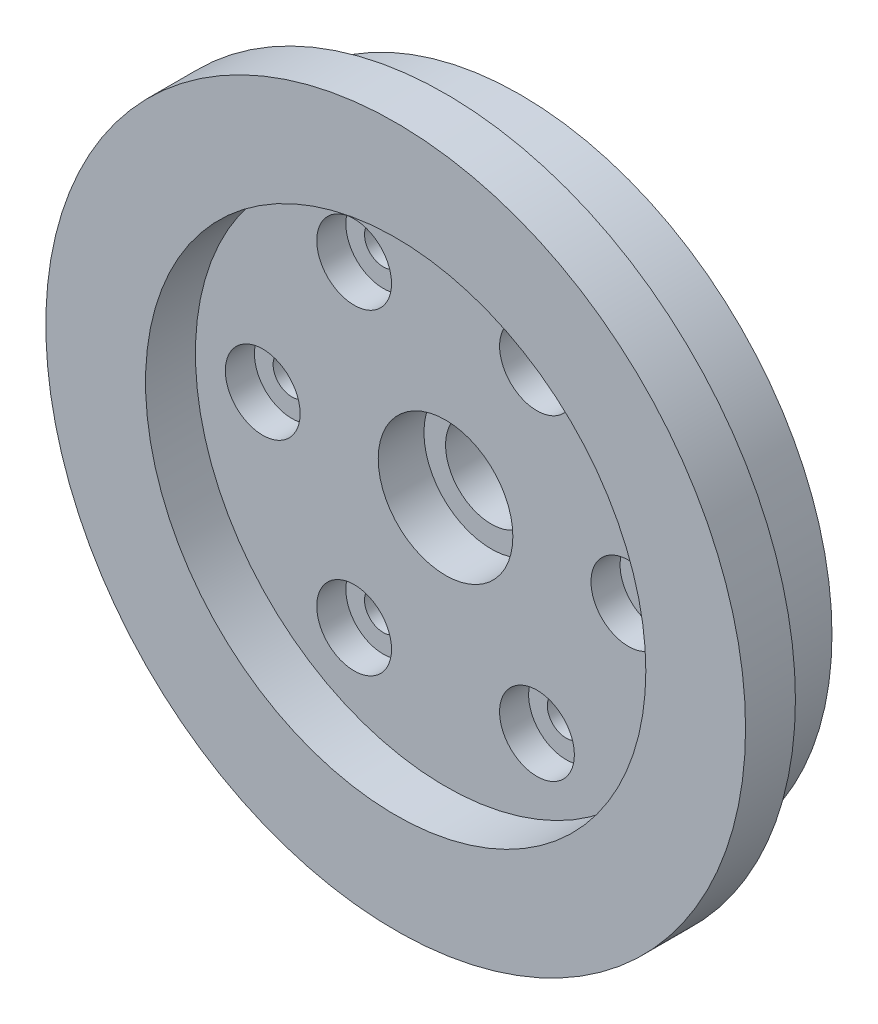
ISO-10303-21;
HEADER;
FILE_DESCRIPTION(('STEP AP214'),'2;1');
FILE_NAME('part.step','',(''),(''),'','','');
FILE_SCHEMA(('AUTOMOTIVE_DESIGN { 1 0 10303 214 1 1 1 1 }'));
ENDSEC;
DATA;
#1=APPLICATION_CONTEXT('core data for automotive mechanical design processes');
#2=APPLICATION_PROTOCOL_DEFINITION('international standard','automotive_design',2000,#1);
#3=PRODUCT_CONTEXT('',#1,'mechanical');
#4=PRODUCT('Part','Part','',(#3));
#5=PRODUCT_RELATED_PRODUCT_CATEGORY('part','',(#4));
#6=PRODUCT_DEFINITION_FORMATION('','',#4);
#7=PRODUCT_DEFINITION_CONTEXT('part definition',#1,'design');
#8=PRODUCT_DEFINITION('design','',#6,#7);
#9=PRODUCT_DEFINITION_SHAPE('','',#8);
#10=(LENGTH_UNIT() NAMED_UNIT(*) SI_UNIT(.MILLI.,.METRE.));
#11=(NAMED_UNIT(*) PLANE_ANGLE_UNIT() SI_UNIT($,.RADIAN.));
#12=(NAMED_UNIT(*) SI_UNIT($,.STERADIAN.) SOLID_ANGLE_UNIT());
#13=UNCERTAINTY_MEASURE_WITH_UNIT(LENGTH_MEASURE(1.E-05),#10,'distance_accuracy_value','');
#14=(GEOMETRIC_REPRESENTATION_CONTEXT(3) GLOBAL_UNCERTAINTY_ASSIGNED_CONTEXT((#13)) GLOBAL_UNIT_ASSIGNED_CONTEXT((#10,
#11,#12)) REPRESENTATION_CONTEXT('',''));
#15=CARTESIAN_POINT('',(0.,0.,0.));
#16=DIRECTION('',(0.,0.,1.));
#17=DIRECTION('',(1.,0.,0.));
#18=AXIS2_PLACEMENT_3D('',#15,#16,#17);
#19=CARTESIAN_POINT('',(0.,0.,10.));
#20=DIRECTION('',(0.,0.,1.));
#21=DIRECTION('',(1.,0.,0.));
#22=AXIS2_PLACEMENT_3D('',#19,#20,#21);
#23=PLANE('',#22);
#24=CARTESIAN_POINT('',(0.,0.,10.));
#25=DIRECTION('',(0.,0.,1.));
#26=DIRECTION('',(1.,0.,0.));
#27=AXIS2_PLACEMENT_3D('',#24,#25,#26);
#28=CIRCLE('',#27,8.1);
#29=CARTESIAN_POINT('',(8.1,0.,10.));
#30=VERTEX_POINT('',#29);
#31=EDGE_CURVE('E126',#30,#30,#28,.T.);
#32=ORIENTED_EDGE('',*,*,#31,.F.);
#33=EDGE_LOOP('',(#32));
#34=FACE_BOUND('',#33,.T.);
#35=CARTESIAN_POINT('',(-11.,19.0525588832576,10.));
#36=DIRECTION('',(0.,0.,1.));
#37=DIRECTION('',(1.,0.,0.));
#38=AXIS2_PLACEMENT_3D('',#35,#36,#37);
#39=CIRCLE('',#38,4.5);
#40=CARTESIAN_POINT('',(-6.50000000000001,19.0525588832576,10.));
#41=VERTEX_POINT('',#40);
#42=EDGE_CURVE('E240',#41,#41,#39,.T.);
#43=ORIENTED_EDGE('',*,*,#42,.F.);
#44=EDGE_LOOP('',(#43));
#45=FACE_BOUND('',#44,.T.);
#46=CARTESIAN_POINT('',(11.,19.0525588832576,10.));
#47=DIRECTION('',(0.,0.,1.));
#48=DIRECTION('',(1.,0.,0.));
#49=AXIS2_PLACEMENT_3D('',#46,#47,#48);
#50=CIRCLE('',#49,4.5);
#51=CARTESIAN_POINT('',(15.5,19.0525588832576,10.));
#52=VERTEX_POINT('',#51);
#53=EDGE_CURVE('E237',#52,#52,#50,.T.);
#54=ORIENTED_EDGE('',*,*,#53,.F.);
#55=EDGE_LOOP('',(#54));
#56=FACE_BOUND('',#55,.T.);
#57=CARTESIAN_POINT('',(22.,0.,10.));
#58=DIRECTION('',(0.,0.,1.));
#59=DIRECTION('',(1.,0.,0.));
#60=AXIS2_PLACEMENT_3D('',#57,#58,#59);
#61=CIRCLE('',#60,4.5);
#62=CARTESIAN_POINT('',(26.5,0.,10.));
#63=VERTEX_POINT('',#62);
#64=EDGE_CURVE('E247',#63,#63,#61,.T.);
#65=ORIENTED_EDGE('',*,*,#64,.F.);
#66=EDGE_LOOP('',(#65));
#67=FACE_BOUND('',#66,.T.);
#68=CARTESIAN_POINT('',(10.9999999999999,-19.0525588832577,10.));
#69=DIRECTION('',(0.,0.,1.));
#70=DIRECTION('',(1.,0.,0.));
#71=AXIS2_PLACEMENT_3D('',#68,#69,#70);
#72=CIRCLE('',#71,4.5);
#73=CARTESIAN_POINT('',(15.4999999999999,-19.0525588832577,10.));
#74=VERTEX_POINT('',#73);
#75=EDGE_CURVE('E216',#74,#74,#72,.T.);
#76=ORIENTED_EDGE('',*,*,#75,.F.);
#77=EDGE_LOOP('',(#76));
#78=FACE_BOUND('',#77,.T.);
#79=CARTESIAN_POINT('',(-11.0000000000002,-19.0525588832576,10.));
#80=DIRECTION('',(0.,0.,1.));
#81=DIRECTION('',(1.,0.,0.));
#82=AXIS2_PLACEMENT_3D('',#79,#80,#81);
#83=CIRCLE('',#82,4.5);
#84=CARTESIAN_POINT('',(-6.50000000000017,-19.0525588832576,10.));
#85=VERTEX_POINT('',#84);
#86=EDGE_CURVE('E217',#85,#85,#83,.T.);
#87=ORIENTED_EDGE('',*,*,#86,.F.);
#88=EDGE_LOOP('',(#87));
#89=FACE_BOUND('',#88,.T.);
#90=CARTESIAN_POINT('',(-22.,2.42861286636753E-13,10.));
#91=DIRECTION('',(0.,0.,1.));
#92=DIRECTION('',(1.,0.,0.));
#93=AXIS2_PLACEMENT_3D('',#90,#91,#92);
#94=CIRCLE('',#93,4.5);
#95=CARTESIAN_POINT('',(-17.5,2.42861286636753E-13,10.));
#96=VERTEX_POINT('',#95);
#97=EDGE_CURVE('E230',#96,#96,#94,.T.);
#98=ORIENTED_EDGE('',*,*,#97,.F.);
#99=EDGE_LOOP('',(#98));
#100=FACE_BOUND('',#99,.T.);
#101=CARTESIAN_POINT('',(0.,0.,10.));
#102=DIRECTION('',(0.,0.,1.));
#103=DIRECTION('',(1.,0.,0.));
#104=AXIS2_PLACEMENT_3D('',#101,#102,#103);
#105=CIRCLE('',#104,30.1);
#106=CARTESIAN_POINT('',(30.1,0.,10.));
#107=VERTEX_POINT('',#106);
#108=EDGE_CURVE('E274',#107,#107,#105,.T.);
#109=ORIENTED_EDGE('',*,*,#108,.T.);
#110=EDGE_LOOP('',(#109));
#111=FACE_BOUND('',#110,.T.);
#112=ADVANCED_FACE('F79',(#34,#45,#56,#67,#78,#89,#100,#111),#23,.T.);
#113=CARTESIAN_POINT('',(-11.,19.0525588832576,10.));
#114=DIRECTION('',(0.,0.,-1.));
#115=DIRECTION('',(-1.,0.,0.));
#116=AXIS2_PLACEMENT_3D('',#113,#114,#115);
#117=CYLINDRICAL_SURFACE('',#116,2.25000000000001);
#118=CARTESIAN_POINT('',(-11.,19.0525588832576,0.));
#119=DIRECTION('',(0.,0.,1.));
#120=DIRECTION('',(1.,0.,0.));
#121=AXIS2_PLACEMENT_3D('',#118,#119,#120);
#122=CIRCLE('',#121,2.25000000000001);
#123=CARTESIAN_POINT('',(-8.75,19.0525588832576,0.));
#124=VERTEX_POINT('',#123);
#125=EDGE_CURVE('E87',#124,#124,#122,.T.);
#126=ORIENTED_EDGE('',*,*,#125,.F.);
#127=EDGE_LOOP('',(#126));
#128=FACE_BOUND('',#127,.T.);
#129=CARTESIAN_POINT('',(-11.,19.0525588832576,6.5));
#130=DIRECTION('',(0.,0.,1.));
#131=DIRECTION('',(1.,0.,0.));
#132=AXIS2_PLACEMENT_3D('',#129,#130,#131);
#133=CIRCLE('',#132,2.25000000000001);
#134=CARTESIAN_POINT('',(-8.75,19.0525588832576,6.5));
#135=VERTEX_POINT('',#134);
#136=EDGE_CURVE('E81',#135,#135,#133,.T.);
#137=ORIENTED_EDGE('',*,*,#136,.T.);
#138=EDGE_LOOP('',(#137));
#139=FACE_BOUND('',#138,.T.);
#140=ADVANCED_FACE('F151',(#128,#139),#117,.F.);
#141=CARTESIAN_POINT('',(11.,19.0525588832577,10.));
#142=DIRECTION('',(0.,0.,-1.));
#143=DIRECTION('',(-1.,0.,0.));
#144=AXIS2_PLACEMENT_3D('',#141,#142,#143);
#145=CYLINDRICAL_SURFACE('',#144,2.25);
#146=CARTESIAN_POINT('',(11.,19.0525588832577,0.));
#147=DIRECTION('',(0.,0.,1.));
#148=DIRECTION('',(1.,0.,0.));
#149=AXIS2_PLACEMENT_3D('',#146,#147,#148);
#150=CIRCLE('',#149,2.25);
#151=CARTESIAN_POINT('',(13.25,19.0525588832577,0.));
#152=VERTEX_POINT('',#151);
#153=EDGE_CURVE('E95',#152,#152,#150,.T.);
#154=ORIENTED_EDGE('',*,*,#153,.F.);
#155=EDGE_LOOP('',(#154));
#156=FACE_BOUND('',#155,.T.);
#157=CARTESIAN_POINT('',(11.,19.0525588832577,6.5));
#158=DIRECTION('',(0.,0.,1.));
#159=DIRECTION('',(1.,0.,0.));
#160=AXIS2_PLACEMENT_3D('',#157,#158,#159);
#161=CIRCLE('',#160,2.25);
#162=CARTESIAN_POINT('',(13.25,19.0525588832577,6.5));
#163=VERTEX_POINT('',#162);
#164=EDGE_CURVE('E108',#163,#163,#161,.T.);
#165=ORIENTED_EDGE('',*,*,#164,.T.);
#166=EDGE_LOOP('',(#165));
#167=FACE_BOUND('',#166,.T.);
#168=ADVANCED_FACE('F146',(#156,#167),#145,.F.);
#169=CARTESIAN_POINT('',(22.,0.,10.));
#170=DIRECTION('',(0.,0.,-1.));
#171=DIRECTION('',(-1.,0.,0.));
#172=AXIS2_PLACEMENT_3D('',#169,#170,#171);
#173=CYLINDRICAL_SURFACE('',#172,2.25);
#174=CARTESIAN_POINT('',(22.,0.,0.));
#175=DIRECTION('',(0.,0.,1.));
#176=DIRECTION('',(1.,0.,0.));
#177=AXIS2_PLACEMENT_3D('',#174,#175,#176);
#178=CIRCLE('',#177,2.25);
#179=CARTESIAN_POINT('',(24.25,0.,0.));
#180=VERTEX_POINT('',#179);
#181=EDGE_CURVE('E139',#180,#180,#178,.T.);
#182=ORIENTED_EDGE('',*,*,#181,.F.);
#183=EDGE_LOOP('',(#182));
#184=FACE_BOUND('',#183,.T.);
#185=CARTESIAN_POINT('',(22.,0.,6.5));
#186=DIRECTION('',(0.,0.,1.));
#187=DIRECTION('',(1.,0.,0.));
#188=AXIS2_PLACEMENT_3D('',#185,#186,#187);
#189=CIRCLE('',#188,2.25);
#190=CARTESIAN_POINT('',(24.25,0.,6.5));
#191=VERTEX_POINT('',#190);
#192=EDGE_CURVE('E106',#191,#191,#189,.T.);
#193=ORIENTED_EDGE('',*,*,#192,.T.);
#194=EDGE_LOOP('',(#193));
#195=FACE_BOUND('',#194,.T.);
#196=ADVANCED_FACE('F147',(#184,#195),#173,.F.);
#197=CARTESIAN_POINT('',(11.,-19.0525588832576,10.));
#198=DIRECTION('',(0.,0.,-1.));
#199=DIRECTION('',(-1.,0.,0.));
#200=AXIS2_PLACEMENT_3D('',#197,#198,#199);
#201=CYLINDRICAL_SURFACE('',#200,2.25);
#202=CARTESIAN_POINT('',(11.,-19.0525588832576,0.));
#203=DIRECTION('',(0.,0.,1.));
#204=DIRECTION('',(1.,0.,0.));
#205=AXIS2_PLACEMENT_3D('',#202,#203,#204);
#206=CIRCLE('',#205,2.25);
#207=CARTESIAN_POINT('',(13.25,-19.0525588832576,0.));
#208=VERTEX_POINT('',#207);
#209=EDGE_CURVE('E140',#208,#208,#206,.T.);
#210=ORIENTED_EDGE('',*,*,#209,.F.);
#211=EDGE_LOOP('',(#210));
#212=FACE_BOUND('',#211,.T.);
#213=CARTESIAN_POINT('',(11.,-19.0525588832576,6.5));
#214=DIRECTION('',(0.,0.,1.));
#215=DIRECTION('',(1.,0.,0.));
#216=AXIS2_PLACEMENT_3D('',#213,#214,#215);
#217=CIRCLE('',#216,2.25);
#218=CARTESIAN_POINT('',(13.25,-19.0525588832576,6.5));
#219=VERTEX_POINT('',#218);
#220=EDGE_CURVE('E101',#219,#219,#217,.T.);
#221=ORIENTED_EDGE('',*,*,#220,.T.);
#222=EDGE_LOOP('',(#221));
#223=FACE_BOUND('',#222,.T.);
#224=ADVANCED_FACE('F160',(#212,#223),#201,.F.);
#225=CARTESIAN_POINT('',(-11.,-19.0525588832577,10.));
#226=DIRECTION('',(0.,0.,-1.));
#227=DIRECTION('',(-1.,0.,0.));
#228=AXIS2_PLACEMENT_3D('',#225,#226,#227);
#229=CYLINDRICAL_SURFACE('',#228,2.25);
#230=CARTESIAN_POINT('',(-11.,-19.0525588832577,0.));
#231=DIRECTION('',(0.,0.,1.));
#232=DIRECTION('',(1.,0.,0.));
#233=AXIS2_PLACEMENT_3D('',#230,#231,#232);
#234=CIRCLE('',#233,2.25);
#235=CARTESIAN_POINT('',(-8.74999999999999,-19.0525588832577,0.));
#236=VERTEX_POINT('',#235);
#237=EDGE_CURVE('E133',#236,#236,#234,.T.);
#238=ORIENTED_EDGE('',*,*,#237,.F.);
#239=EDGE_LOOP('',(#238));
#240=FACE_BOUND('',#239,.T.);
#241=CARTESIAN_POINT('',(-11.,-19.0525588832577,6.5));
#242=DIRECTION('',(0.,0.,1.));
#243=DIRECTION('',(1.,0.,0.));
#244=AXIS2_PLACEMENT_3D('',#241,#242,#243);
#245=CIRCLE('',#244,2.25);
#246=CARTESIAN_POINT('',(-8.74999999999999,-19.0525588832577,6.5));
#247=VERTEX_POINT('',#246);
#248=EDGE_CURVE('E100',#247,#247,#245,.T.);
#249=ORIENTED_EDGE('',*,*,#248,.T.);
#250=EDGE_LOOP('',(#249));
#251=FACE_BOUND('',#250,.T.);
#252=ADVANCED_FACE('F189',(#240,#251),#229,.F.);
#253=CARTESIAN_POINT('',(-22.,0.,10.));
#254=DIRECTION('',(0.,0.,-1.));
#255=DIRECTION('',(-1.,0.,0.));
#256=AXIS2_PLACEMENT_3D('',#253,#254,#255);
#257=CYLINDRICAL_SURFACE('',#256,2.25);
#258=CARTESIAN_POINT('',(-22.,0.,0.));
#259=DIRECTION('',(0.,0.,1.));
#260=DIRECTION('',(1.,0.,0.));
#261=AXIS2_PLACEMENT_3D('',#258,#259,#260);
#262=CIRCLE('',#261,2.25);
#263=CARTESIAN_POINT('',(-19.75,0.,0.));
#264=VERTEX_POINT('',#263);
#265=EDGE_CURVE('E131',#264,#264,#262,.T.);
#266=ORIENTED_EDGE('',*,*,#265,.F.);
#267=EDGE_LOOP('',(#266));
#268=FACE_BOUND('',#267,.T.);
#269=CARTESIAN_POINT('',(-22.,0.,6.5));
#270=DIRECTION('',(0.,0.,1.));
#271=DIRECTION('',(1.,0.,0.));
#272=AXIS2_PLACEMENT_3D('',#269,#270,#271);
#273=CIRCLE('',#272,2.25);
#274=CARTESIAN_POINT('',(-19.75,0.,6.5));
#275=VERTEX_POINT('',#274);
#276=EDGE_CURVE('E98',#275,#275,#273,.T.);
#277=ORIENTED_EDGE('',*,*,#276,.T.);
#278=EDGE_LOOP('',(#277));
#279=FACE_BOUND('',#278,.T.);
#280=ADVANCED_FACE('F179',(#268,#279),#257,.F.);
#281=CARTESIAN_POINT('',(0.,0.,10.));
#282=DIRECTION('',(0.,0.,-1.));
#283=DIRECTION('',(-1.,0.,0.));
#284=AXIS2_PLACEMENT_3D('',#281,#282,#283);
#285=CYLINDRICAL_SURFACE('',#284,8.1);
#286=ORIENTED_EDGE('',*,*,#31,.T.);
#287=EDGE_LOOP('',(#286));
#288=FACE_BOUND('',#287,.T.);
#289=CARTESIAN_POINT('',(0.,0.,4.5));
#290=DIRECTION('',(0.,0.,-1.));
#291=DIRECTION('',(-1.,0.,0.));
#292=AXIS2_PLACEMENT_3D('',#289,#290,#291);
#293=CIRCLE('',#292,8.1);
#294=CARTESIAN_POINT('',(-8.1,0.,4.5));
#295=VERTEX_POINT('',#294);
#296=EDGE_CURVE('E125',#295,#295,#293,.T.);
#297=ORIENTED_EDGE('',*,*,#296,.T.);
#298=EDGE_LOOP('',(#297));
#299=FACE_BOUND('',#298,.T.);
#300=ADVANCED_FACE('F175',(#288,#299),#285,.F.);
#301=CARTESIAN_POINT('',(0.,0.,0.));
#302=DIRECTION('',(0.,0.,1.));
#303=DIRECTION('',(1.,0.,0.));
#304=AXIS2_PLACEMENT_3D('',#301,#302,#303);
#305=PLANE('',#304);
#306=CARTESIAN_POINT('',(0.,0.,0.));
#307=DIRECTION('',(0.,0.,1.));
#308=DIRECTION('',(1.,0.,0.));
#309=AXIS2_PLACEMENT_3D('',#306,#307,#308);
#310=CIRCLE('',#309,30.1);
#311=CARTESIAN_POINT('',(30.1,0.,0.));
#312=VERTEX_POINT('',#311);
#313=EDGE_CURVE('E11',#312,#312,#310,.T.);
#314=ORIENTED_EDGE('',*,*,#313,.F.);
#315=EDGE_LOOP('',(#314));
#316=FACE_BOUND('',#315,.T.);
#317=ORIENTED_EDGE('',*,*,#125,.T.);
#318=EDGE_LOOP('',(#317));
#319=FACE_BOUND('',#318,.T.);
#320=ORIENTED_EDGE('',*,*,#153,.T.);
#321=EDGE_LOOP('',(#320));
#322=FACE_BOUND('',#321,.T.);
#323=ORIENTED_EDGE('',*,*,#181,.T.);
#324=EDGE_LOOP('',(#323));
#325=FACE_BOUND('',#324,.T.);
#326=ORIENTED_EDGE('',*,*,#209,.T.);
#327=EDGE_LOOP('',(#326));
#328=FACE_BOUND('',#327,.T.);
#329=ORIENTED_EDGE('',*,*,#237,.T.);
#330=EDGE_LOOP('',(#329));
#331=FACE_BOUND('',#330,.T.);
#332=ORIENTED_EDGE('',*,*,#265,.T.);
#333=EDGE_LOOP('',(#332));
#334=FACE_BOUND('',#333,.T.);
#335=CARTESIAN_POINT('',(0.,0.,0.));
#336=DIRECTION('',(0.,0.,-1.));
#337=DIRECTION('',(-1.,0.,0.));
#338=AXIS2_PLACEMENT_3D('',#335,#336,#337);
#339=CIRCLE('',#338,5.5);
#340=CARTESIAN_POINT('',(-5.5,0.,0.));
#341=VERTEX_POINT('',#340);
#342=EDGE_CURVE('E113',#341,#341,#339,.T.);
#343=ORIENTED_EDGE('',*,*,#342,.F.);
#344=EDGE_LOOP('',(#343));
#345=FACE_BOUND('',#344,.T.);
#346=ADVANCED_FACE('F143',(#316,#319,#322,#325,#328,#331,#334,#345),#305,.F.);
#347=CARTESIAN_POINT('',(0.,0.,10.));
#348=DIRECTION('',(0.,0.,-1.));
#349=DIRECTION('',(-1.,0.,0.));
#350=AXIS2_PLACEMENT_3D('',#347,#348,#349);
#351=CYLINDRICAL_SURFACE('',#350,30.1);
#352=CARTESIAN_POINT('',(0.,0.,1.));
#353=DIRECTION('',(0.,0.,-1.));
#354=DIRECTION('',(-1.,0.,0.));
#355=AXIS2_PLACEMENT_3D('',#352,#353,#354);
#356=CIRCLE('',#355,30.1);
#357=CARTESIAN_POINT('',(-30.1,0.,1.));
#358=VERTEX_POINT('',#357);
#359=EDGE_CURVE('E290',#358,#358,#356,.T.);
#360=ORIENTED_EDGE('',*,*,#359,.T.);
#361=EDGE_LOOP('',(#360));
#362=FACE_BOUND('',#361,.T.);
#363=ORIENTED_EDGE('',*,*,#313,.T.);
#364=EDGE_LOOP('',(#363));
#365=FACE_BOUND('',#364,.T.);
#366=ADVANCED_FACE('F83',(#362,#365),#351,.T.);
#367=CARTESIAN_POINT('',(0.,0.,4.5));
#368=DIRECTION('',(0.,0.,-1.));
#369=DIRECTION('',(-1.,0.,0.));
#370=AXIS2_PLACEMENT_3D('',#367,#368,#369);
#371=PLANE('',#370);
#372=CARTESIAN_POINT('',(0.,0.,4.5));
#373=DIRECTION('',(0.,0.,-1.));
#374=DIRECTION('',(-1.,0.,0.));
#375=AXIS2_PLACEMENT_3D('',#372,#373,#374);
#376=CIRCLE('',#375,5.5);
#377=CARTESIAN_POINT('',(-5.5,0.,4.5));
#378=VERTEX_POINT('',#377);
#379=EDGE_CURVE('E120',#378,#378,#376,.T.);
#380=ORIENTED_EDGE('',*,*,#379,.T.);
#381=EDGE_LOOP('',(#380));
#382=FACE_BOUND('',#381,.T.);
#383=ORIENTED_EDGE('',*,*,#296,.F.);
#384=EDGE_LOOP('',(#383));
#385=FACE_BOUND('',#384,.T.);
#386=ADVANCED_FACE('F178',(#382,#385),#371,.F.);
#387=CARTESIAN_POINT('',(0.,0.,4.5));
#388=DIRECTION('',(0.,0.,-1.));
#389=DIRECTION('',(-1.,0.,0.));
#390=AXIS2_PLACEMENT_3D('',#387,#388,#389);
#391=CYLINDRICAL_SURFACE('',#390,5.5);
#392=ORIENTED_EDGE('',*,*,#379,.F.);
#393=EDGE_LOOP('',(#392));
#394=FACE_BOUND('',#393,.T.);
#395=ORIENTED_EDGE('',*,*,#342,.T.);
#396=EDGE_LOOP('',(#395));
#397=FACE_BOUND('',#396,.T.);
#398=ADVANCED_FACE('F351',(#394,#397),#391,.F.);
#399=CARTESIAN_POINT('',(-22.,2.42861286636753E-13,6.5));
#400=DIRECTION('',(0.,0.,1.));
#401=DIRECTION('',(1.,0.,0.));
#402=AXIS2_PLACEMENT_3D('',#399,#400,#401);
#403=CYLINDRICAL_SURFACE('',#402,4.5);
#404=CARTESIAN_POINT('',(-22.,2.42861286636753E-13,6.5));
#405=DIRECTION('',(0.,0.,1.));
#406=DIRECTION('',(1.,0.,0.));
#407=AXIS2_PLACEMENT_3D('',#404,#405,#406);
#408=CIRCLE('',#407,4.5);
#409=CARTESIAN_POINT('',(-17.5,2.42861286636753E-13,6.5));
#410=VERTEX_POINT('',#409);
#411=EDGE_CURVE('E235',#410,#410,#408,.T.);
#412=ORIENTED_EDGE('',*,*,#411,.F.);
#413=EDGE_LOOP('',(#412));
#414=FACE_BOUND('',#413,.T.);
#415=ORIENTED_EDGE('',*,*,#97,.T.);
#416=EDGE_LOOP('',(#415));
#417=FACE_BOUND('',#416,.T.);
#418=ADVANCED_FACE('F349',(#414,#417),#403,.F.);
#419=CARTESIAN_POINT('',(-22.,2.42861286636753E-13,6.5));
#420=DIRECTION('',(0.,0.,1.));
#421=DIRECTION('',(1.,0.,0.));
#422=AXIS2_PLACEMENT_3D('',#419,#420,#421);
#423=PLANE('',#422);
#424=ORIENTED_EDGE('',*,*,#276,.F.);
#425=EDGE_LOOP('',(#424));
#426=FACE_BOUND('',#425,.T.);
#427=ORIENTED_EDGE('',*,*,#411,.T.);
#428=EDGE_LOOP('',(#427));
#429=FACE_BOUND('',#428,.T.);
#430=ADVANCED_FACE('F341',(#426,#429),#423,.T.);
#431=CARTESIAN_POINT('',(-11.0000000000002,-19.0525588832576,6.5));
#432=DIRECTION('',(0.,0.,1.));
#433=DIRECTION('',(1.,0.,0.));
#434=AXIS2_PLACEMENT_3D('',#431,#432,#433);
#435=CYLINDRICAL_SURFACE('',#434,4.5);
#436=CARTESIAN_POINT('',(-11.0000000000002,-19.0525588832576,6.5));
#437=DIRECTION('',(0.,0.,1.));
#438=DIRECTION('',(1.,0.,0.));
#439=AXIS2_PLACEMENT_3D('',#436,#437,#438);
#440=CIRCLE('',#439,4.5);
#441=CARTESIAN_POINT('',(-6.50000000000017,-19.0525588832576,6.5));
#442=VERTEX_POINT('',#441);
#443=EDGE_CURVE('E222',#442,#442,#440,.T.);
#444=ORIENTED_EDGE('',*,*,#443,.F.);
#445=EDGE_LOOP('',(#444));
#446=FACE_BOUND('',#445,.T.);
#447=ORIENTED_EDGE('',*,*,#86,.T.);
#448=EDGE_LOOP('',(#447));
#449=FACE_BOUND('',#448,.T.);
#450=ADVANCED_FACE('F338',(#446,#449),#435,.F.);
#451=CARTESIAN_POINT('',(-11.0000000000002,-19.0525588832576,6.5));
#452=DIRECTION('',(0.,0.,1.));
#453=DIRECTION('',(1.,0.,0.));
#454=AXIS2_PLACEMENT_3D('',#451,#452,#453);
#455=PLANE('',#454);
#456=ORIENTED_EDGE('',*,*,#248,.F.);
#457=EDGE_LOOP('',(#456));
#458=FACE_BOUND('',#457,.T.);
#459=ORIENTED_EDGE('',*,*,#443,.T.);
#460=EDGE_LOOP('',(#459));
#461=FACE_BOUND('',#460,.T.);
#462=ADVANCED_FACE('F336',(#458,#461),#455,.T.);
#463=CARTESIAN_POINT('',(10.9999999999999,-19.0525588832577,6.5));
#464=DIRECTION('',(0.,0.,1.));
#465=DIRECTION('',(1.,0.,0.));
#466=AXIS2_PLACEMENT_3D('',#463,#464,#465);
#467=CYLINDRICAL_SURFACE('',#466,4.5);
#468=CARTESIAN_POINT('',(10.9999999999999,-19.0525588832577,6.5));
#469=DIRECTION('',(0.,0.,1.));
#470=DIRECTION('',(1.,0.,0.));
#471=AXIS2_PLACEMENT_3D('',#468,#469,#470);
#472=CIRCLE('',#471,4.5);
#473=CARTESIAN_POINT('',(15.4999999999999,-19.0525588832577,6.5));
#474=VERTEX_POINT('',#473);
#475=EDGE_CURVE('E214',#474,#474,#472,.T.);
#476=ORIENTED_EDGE('',*,*,#475,.F.);
#477=EDGE_LOOP('',(#476));
#478=FACE_BOUND('',#477,.T.);
#479=ORIENTED_EDGE('',*,*,#75,.T.);
#480=EDGE_LOOP('',(#479));
#481=FACE_BOUND('',#480,.T.);
#482=ADVANCED_FACE('F208',(#478,#481),#467,.F.);
#483=CARTESIAN_POINT('',(10.9999999999999,-19.0525588832577,6.5));
#484=DIRECTION('',(0.,0.,1.));
#485=DIRECTION('',(1.,0.,0.));
#486=AXIS2_PLACEMENT_3D('',#483,#484,#485);
#487=PLANE('',#486);
#488=ORIENTED_EDGE('',*,*,#220,.F.);
#489=EDGE_LOOP('',(#488));
#490=FACE_BOUND('',#489,.T.);
#491=ORIENTED_EDGE('',*,*,#475,.T.);
#492=EDGE_LOOP('',(#491));
#493=FACE_BOUND('',#492,.T.);
#494=ADVANCED_FACE('F207',(#490,#493),#487,.T.);
#495=CARTESIAN_POINT('',(22.,0.,6.5));
#496=DIRECTION('',(0.,0.,1.));
#497=DIRECTION('',(1.,0.,0.));
#498=AXIS2_PLACEMENT_3D('',#495,#496,#497);
#499=CYLINDRICAL_SURFACE('',#498,4.5);
#500=CARTESIAN_POINT('',(22.,0.,6.5));
#501=DIRECTION('',(0.,0.,1.));
#502=DIRECTION('',(1.,0.,0.));
#503=AXIS2_PLACEMENT_3D('',#500,#501,#502);
#504=CIRCLE('',#503,4.5);
#505=CARTESIAN_POINT('',(26.5,0.,6.5));
#506=VERTEX_POINT('',#505);
#507=EDGE_CURVE('E220',#506,#506,#504,.T.);
#508=ORIENTED_EDGE('',*,*,#507,.F.);
#509=EDGE_LOOP('',(#508));
#510=FACE_BOUND('',#509,.T.);
#511=ORIENTED_EDGE('',*,*,#64,.T.);
#512=EDGE_LOOP('',(#511));
#513=FACE_BOUND('',#512,.T.);
#514=ADVANCED_FACE('F209',(#510,#513),#499,.F.);
#515=CARTESIAN_POINT('',(22.,0.,6.5));
#516=DIRECTION('',(0.,0.,1.));
#517=DIRECTION('',(1.,0.,0.));
#518=AXIS2_PLACEMENT_3D('',#515,#516,#517);
#519=PLANE('',#518);
#520=ORIENTED_EDGE('',*,*,#192,.F.);
#521=EDGE_LOOP('',(#520));
#522=FACE_BOUND('',#521,.T.);
#523=ORIENTED_EDGE('',*,*,#507,.T.);
#524=EDGE_LOOP('',(#523));
#525=FACE_BOUND('',#524,.T.);
#526=ADVANCED_FACE('F256',(#522,#525),#519,.T.);
#527=CARTESIAN_POINT('',(11.,19.0525588832576,6.5));
#528=DIRECTION('',(0.,0.,1.));
#529=DIRECTION('',(1.,0.,0.));
#530=AXIS2_PLACEMENT_3D('',#527,#528,#529);
#531=CYLINDRICAL_SURFACE('',#530,4.5);
#532=CARTESIAN_POINT('',(11.,19.0525588832576,6.5));
#533=DIRECTION('',(0.,0.,1.));
#534=DIRECTION('',(1.,0.,0.));
#535=AXIS2_PLACEMENT_3D('',#532,#533,#534);
#536=CIRCLE('',#535,4.5);
#537=CARTESIAN_POINT('',(15.5,19.0525588832576,6.5));
#538=VERTEX_POINT('',#537);
#539=EDGE_CURVE('E243',#538,#538,#536,.T.);
#540=ORIENTED_EDGE('',*,*,#539,.F.);
#541=EDGE_LOOP('',(#540));
#542=FACE_BOUND('',#541,.T.);
#543=ORIENTED_EDGE('',*,*,#53,.T.);
#544=EDGE_LOOP('',(#543));
#545=FACE_BOUND('',#544,.T.);
#546=ADVANCED_FACE('F322',(#542,#545),#531,.F.);
#547=CARTESIAN_POINT('',(11.,19.0525588832576,6.5));
#548=DIRECTION('',(0.,0.,1.));
#549=DIRECTION('',(1.,0.,0.));
#550=AXIS2_PLACEMENT_3D('',#547,#548,#549);
#551=PLANE('',#550);
#552=ORIENTED_EDGE('',*,*,#164,.F.);
#553=EDGE_LOOP('',(#552));
#554=FACE_BOUND('',#553,.T.);
#555=ORIENTED_EDGE('',*,*,#539,.T.);
#556=EDGE_LOOP('',(#555));
#557=FACE_BOUND('',#556,.T.);
#558=ADVANCED_FACE('F329',(#554,#557),#551,.T.);
#559=CARTESIAN_POINT('',(-11.,19.0525588832576,6.5));
#560=DIRECTION('',(0.,0.,1.));
#561=DIRECTION('',(1.,0.,0.));
#562=AXIS2_PLACEMENT_3D('',#559,#560,#561);
#563=CYLINDRICAL_SURFACE('',#562,4.5);
#564=CARTESIAN_POINT('',(-11.,19.0525588832576,6.5));
#565=DIRECTION('',(0.,0.,1.));
#566=DIRECTION('',(1.,0.,0.));
#567=AXIS2_PLACEMENT_3D('',#564,#565,#566);
#568=CIRCLE('',#567,4.5);
#569=CARTESIAN_POINT('',(-6.50000000000001,19.0525588832576,6.5));
#570=VERTEX_POINT('',#569);
#571=EDGE_CURVE('E99',#570,#570,#568,.T.);
#572=ORIENTED_EDGE('',*,*,#571,.F.);
#573=EDGE_LOOP('',(#572));
#574=FACE_BOUND('',#573,.T.);
#575=ORIENTED_EDGE('',*,*,#42,.T.);
#576=EDGE_LOOP('',(#575));
#577=FACE_BOUND('',#576,.T.);
#578=ADVANCED_FACE('F331',(#574,#577),#563,.F.);
#579=CARTESIAN_POINT('',(-11.,19.0525588832576,6.5));
#580=DIRECTION('',(0.,0.,1.));
#581=DIRECTION('',(1.,0.,0.));
#582=AXIS2_PLACEMENT_3D('',#579,#580,#581);
#583=PLANE('',#582);
#584=ORIENTED_EDGE('',*,*,#136,.F.);
#585=EDGE_LOOP('',(#584));
#586=FACE_BOUND('',#585,.T.);
#587=ORIENTED_EDGE('',*,*,#571,.T.);
#588=EDGE_LOOP('',(#587));
#589=FACE_BOUND('',#588,.T.);
#590=ADVANCED_FACE('F321',(#586,#589),#583,.T.);
#591=CARTESIAN_POINT('',(0.,0.,1.));
#592=DIRECTION('',(0.,0.,-1.));
#593=DIRECTION('',(-1.,0.,0.));
#594=AXIS2_PLACEMENT_3D('',#591,#592,#593);
#595=PLANE('',#594);
#596=CARTESIAN_POINT('',(0.,0.,1.));
#597=DIRECTION('',(0.,0.,-1.));
#598=DIRECTION('',(-1.,0.,0.));
#599=AXIS2_PLACEMENT_3D('',#596,#597,#598);
#600=CIRCLE('',#599,37.5);
#601=CARTESIAN_POINT('',(-37.5,0.,1.));
#602=VERTEX_POINT('',#601);
#603=EDGE_CURVE('E232',#602,#602,#600,.T.);
#604=ORIENTED_EDGE('',*,*,#603,.T.);
#605=EDGE_LOOP('',(#604));
#606=FACE_BOUND('',#605,.T.);
#607=ORIENTED_EDGE('',*,*,#359,.F.);
#608=EDGE_LOOP('',(#607));
#609=FACE_BOUND('',#608,.T.);
#610=ADVANCED_FACE('F292',(#606,#609),#595,.T.);
#611=CARTESIAN_POINT('',(0.,0.,1.));
#612=DIRECTION('',(0.,0.,1.));
#613=DIRECTION('',(1.,0.,0.));
#614=AXIS2_PLACEMENT_3D('',#611,#612,#613);
#615=CYLINDRICAL_SURFACE('',#614,37.5);
#616=ORIENTED_EDGE('',*,*,#603,.F.);
#617=EDGE_LOOP('',(#616));
#618=FACE_BOUND('',#617,.T.);
#619=CARTESIAN_POINT('',(0.,0.,10.));
#620=DIRECTION('',(0.,0.,-1.));
#621=DIRECTION('',(-1.,0.,0.));
#622=AXIS2_PLACEMENT_3D('',#619,#620,#621);
#623=CIRCLE('',#622,37.5);
#624=CARTESIAN_POINT('',(-37.5,0.,10.));
#625=VERTEX_POINT('',#624);
#626=EDGE_CURVE('E252',#625,#625,#623,.T.);
#627=ORIENTED_EDGE('',*,*,#626,.T.);
#628=EDGE_LOOP('',(#627));
#629=FACE_BOUND('',#628,.T.);
#630=ADVANCED_FACE('F294',(#618,#629),#615,.T.);
#631=CARTESIAN_POINT('',(0.,0.,16.));
#632=DIRECTION('',(0.,0.,1.));
#633=DIRECTION('',(1.,0.,0.));
#634=AXIS2_PLACEMENT_3D('',#631,#632,#633);
#635=PLANE('',#634);
#636=CARTESIAN_POINT('',(0.,0.,16.));
#637=DIRECTION('',(0.,0.,1.));
#638=DIRECTION('',(1.,0.,0.));
#639=AXIS2_PLACEMENT_3D('',#636,#637,#638);
#640=CIRCLE('',#639,42.1);
#641=CARTESIAN_POINT('',(42.1,0.,16.));
#642=VERTEX_POINT('',#641);
#643=EDGE_CURVE('E282',#642,#642,#640,.T.);
#644=ORIENTED_EDGE('',*,*,#643,.T.);
#645=EDGE_LOOP('',(#644));
#646=FACE_BOUND('',#645,.T.);
#647=CARTESIAN_POINT('',(0.,0.,16.));
#648=DIRECTION('',(0.,0.,1.));
#649=DIRECTION('',(1.,0.,0.));
#650=AXIS2_PLACEMENT_3D('',#647,#648,#649);
#651=CIRCLE('',#650,30.1);
#652=CARTESIAN_POINT('',(30.1,0.,16.));
#653=VERTEX_POINT('',#652);
#654=EDGE_CURVE('E278',#653,#653,#651,.T.);
#655=ORIENTED_EDGE('',*,*,#654,.F.);
#656=EDGE_LOOP('',(#655));
#657=FACE_BOUND('',#656,.T.);
#658=ADVANCED_FACE('F296',(#646,#657),#635,.T.);
#659=CARTESIAN_POINT('',(0.,0.,10.));
#660=DIRECTION('',(0.,0.,1.));
#661=DIRECTION('',(1.,0.,0.));
#662=AXIS2_PLACEMENT_3D('',#659,#660,#661);
#663=PLANE('',#662);
#664=ORIENTED_EDGE('',*,*,#626,.F.);
#665=EDGE_LOOP('',(#664));
#666=FACE_BOUND('',#665,.T.);
#667=CARTESIAN_POINT('',(0.,0.,10.));
#668=DIRECTION('',(0.,0.,1.));
#669=DIRECTION('',(1.,0.,0.));
#670=AXIS2_PLACEMENT_3D('',#667,#668,#669);
#671=CIRCLE('',#670,42.1);
#672=CARTESIAN_POINT('',(42.1,0.,10.));
#673=VERTEX_POINT('',#672);
#674=EDGE_CURVE('E279',#673,#673,#671,.T.);
#675=ORIENTED_EDGE('',*,*,#674,.F.);
#676=EDGE_LOOP('',(#675));
#677=FACE_BOUND('',#676,.T.);
#678=ADVANCED_FACE('F303',(#666,#677),#663,.F.);
#679=CARTESIAN_POINT('',(0.,0.,16.));
#680=DIRECTION('',(0.,0.,-1.));
#681=DIRECTION('',(-1.,0.,0.));
#682=AXIS2_PLACEMENT_3D('',#679,#680,#681);
#683=CYLINDRICAL_SURFACE('',#682,42.1);
#684=ORIENTED_EDGE('',*,*,#643,.F.);
#685=EDGE_LOOP('',(#684));
#686=FACE_BOUND('',#685,.T.);
#687=ORIENTED_EDGE('',*,*,#674,.T.);
#688=EDGE_LOOP('',(#687));
#689=FACE_BOUND('',#688,.T.);
#690=ADVANCED_FACE('F306',(#686,#689),#683,.T.);
#691=CARTESIAN_POINT('',(0.,0.,16.));
#692=DIRECTION('',(0.,0.,-1.));
#693=DIRECTION('',(-1.,0.,0.));
#694=AXIS2_PLACEMENT_3D('',#691,#692,#693);
#695=CYLINDRICAL_SURFACE('',#694,30.1);
#696=ORIENTED_EDGE('',*,*,#654,.T.);
#697=EDGE_LOOP('',(#696));
#698=FACE_BOUND('',#697,.T.);
#699=ORIENTED_EDGE('',*,*,#108,.F.);
#700=EDGE_LOOP('',(#699));
#701=FACE_BOUND('',#700,.T.);
#702=ADVANCED_FACE('F311',(#698,#701),#695,.F.);
#703=CLOSED_SHELL('',(#112,#140,#168,#196,#224,#252,#280,#300,#346,#366,#386,#398,#418,#430,
#450,#462,#482,#494,#514,#526,#546,#558,#578,#590,#610,#630,#658,#678,#690,#702));
#704=MANIFOLD_SOLID_BREP('B2',#703);
#705=ADVANCED_BREP_SHAPE_REPRESENTATION('',(#18,#704),#14);
#706=SHAPE_DEFINITION_REPRESENTATION(#9,#705);
ENDSEC;
END-ISO-10303-21;
